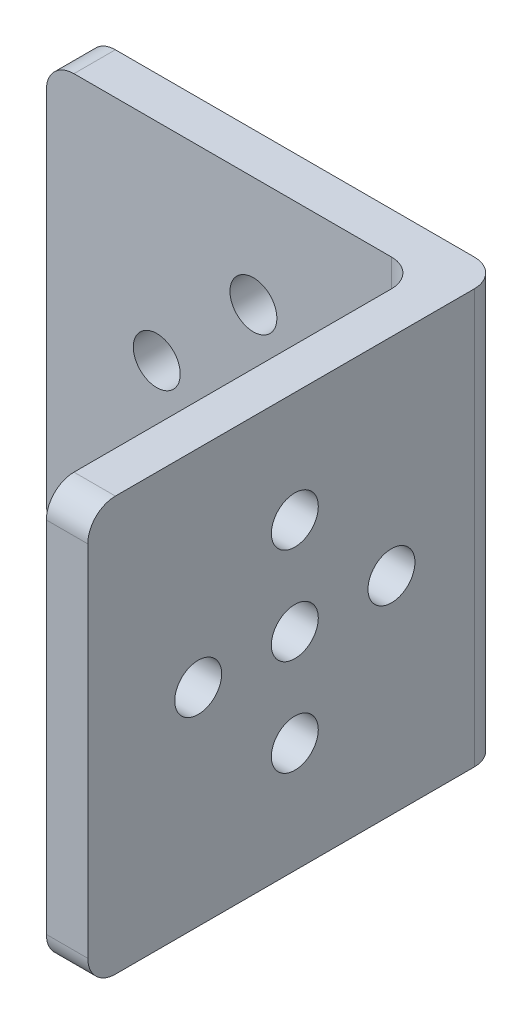
ISO-10303-21;
HEADER;
FILE_DESCRIPTION(('STEP AP214'),'2;1');
FILE_NAME('part.step','',(''),(''),'','','');
FILE_SCHEMA(('AUTOMOTIVE_DESIGN { 1 0 10303 214 1 1 1 1 }'));
ENDSEC;
DATA;
#1=APPLICATION_CONTEXT('core data for automotive mechanical design processes');
#2=APPLICATION_PROTOCOL_DEFINITION('international standard','automotive_design',2000,#1);
#3=PRODUCT_CONTEXT('',#1,'mechanical');
#4=PRODUCT('Part','Part','',(#3));
#5=PRODUCT_RELATED_PRODUCT_CATEGORY('part','',(#4));
#6=PRODUCT_DEFINITION_FORMATION('','',#4);
#7=PRODUCT_DEFINITION_CONTEXT('part definition',#1,'design');
#8=PRODUCT_DEFINITION('design','',#6,#7);
#9=PRODUCT_DEFINITION_SHAPE('','',#8);
#10=(LENGTH_UNIT() NAMED_UNIT(*) SI_UNIT(.MILLI.,.METRE.));
#11=(NAMED_UNIT(*) PLANE_ANGLE_UNIT() SI_UNIT($,.RADIAN.));
#12=(NAMED_UNIT(*) SI_UNIT($,.STERADIAN.) SOLID_ANGLE_UNIT());
#13=UNCERTAINTY_MEASURE_WITH_UNIT(LENGTH_MEASURE(1.E-05),#10,'distance_accuracy_value','');
#14=(GEOMETRIC_REPRESENTATION_CONTEXT(3) GLOBAL_UNCERTAINTY_ASSIGNED_CONTEXT((#13)) GLOBAL_UNIT_ASSIGNED_CONTEXT((#10,
#11,#12)) REPRESENTATION_CONTEXT('',''));
#15=CARTESIAN_POINT('',(0.,0.,0.));
#16=DIRECTION('',(0.,0.,1.));
#17=DIRECTION('',(1.,0.,0.));
#18=AXIS2_PLACEMENT_3D('',#15,#16,#17);
#19=CARTESIAN_POINT('',(15.,0.,30.));
#20=DIRECTION('',(-1.,0.,0.));
#21=DIRECTION('',(0.,-1.,0.));
#22=AXIS2_PLACEMENT_3D('',#19,#20,#21);
#23=PLANE('',#22);
#24=CARTESIAN_POINT('',(15.,7.,15.));
#25=DIRECTION('',(1.,0.,0.));
#26=DIRECTION('',(0.,0.,-1.));
#27=AXIS2_PLACEMENT_3D('',#24,#25,#26);
#28=CIRCLE('',#27,1.69999999999999);
#29=CARTESIAN_POINT('',(15.,7.,13.3));
#30=VERTEX_POINT('',#29);
#31=EDGE_CURVE('E493',#30,#30,#28,.T.);
#32=ORIENTED_EDGE('',*,*,#31,.F.);
#33=EDGE_LOOP('',(#32));
#34=FACE_BOUND('',#33,.T.);
#35=CARTESIAN_POINT('',(15.,-7.,15.));
#36=DIRECTION('',(1.,0.,0.));
#37=DIRECTION('',(0.,0.,-1.));
#38=AXIS2_PLACEMENT_3D('',#35,#36,#37);
#39=CIRCLE('',#38,1.69999999999999);
#40=CARTESIAN_POINT('',(15.,-7.,13.3));
#41=VERTEX_POINT('',#40);
#42=EDGE_CURVE('E515',#41,#41,#39,.T.);
#43=ORIENTED_EDGE('',*,*,#42,.F.);
#44=EDGE_LOOP('',(#43));
#45=FACE_BOUND('',#44,.T.);
#46=DIRECTION('',(0.,0.,-1.));
#47=VECTOR('',#46,1.);
#48=CARTESIAN_POINT('',(15.,15.,30.));
#49=LINE('',#48,#47);
#50=CARTESIAN_POINT('',(15.,15.,28.));
#51=VERTEX_POINT('',#50);
#52=CARTESIAN_POINT('',(15.,15.,2.));
#53=VERTEX_POINT('',#52);
#54=EDGE_CURVE('E127',#51,#53,#49,.T.);
#55=ORIENTED_EDGE('',*,*,#54,.F.);
#56=CARTESIAN_POINT('',(15.,13.,28.));
#57=DIRECTION('',(-1.,0.,0.));
#58=DIRECTION('',(0.,-1.,0.));
#59=AXIS2_PLACEMENT_3D('',#56,#57,#58);
#60=CIRCLE('',#59,2.);
#61=CARTESIAN_POINT('',(15.,13.,30.));
#62=VERTEX_POINT('',#61);
#63=EDGE_CURVE('E198',#51,#62,#60,.F.);
#64=ORIENTED_EDGE('',*,*,#63,.T.);
#65=DIRECTION('',(0.,1.,0.));
#66=VECTOR('',#65,1.);
#67=CARTESIAN_POINT('',(15.,0.,30.));
#68=LINE('',#67,#66);
#69=CARTESIAN_POINT('',(15.,-13.,30.));
#70=VERTEX_POINT('',#69);
#71=EDGE_CURVE('E206',#70,#62,#68,.T.);
#72=ORIENTED_EDGE('',*,*,#71,.F.);
#73=CARTESIAN_POINT('',(15.,-13.,28.));
#74=DIRECTION('',(-1.,0.,0.));
#75=DIRECTION('',(0.,-1.,0.));
#76=AXIS2_PLACEMENT_3D('',#73,#74,#75);
#77=CIRCLE('',#76,2.);
#78=CARTESIAN_POINT('',(15.,-15.,28.));
#79=VERTEX_POINT('',#78);
#80=EDGE_CURVE('E196',#70,#79,#77,.F.);
#81=ORIENTED_EDGE('',*,*,#80,.T.);
#82=DIRECTION('',(0.,0.,-1.));
#83=VECTOR('',#82,1.);
#84=CARTESIAN_POINT('',(15.,-15.,30.));
#85=LINE('',#84,#83);
#86=CARTESIAN_POINT('',(15.,-15.,2.));
#87=VERTEX_POINT('',#86);
#88=EDGE_CURVE('E138',#79,#87,#85,.T.);
#89=ORIENTED_EDGE('',*,*,#88,.T.);
#90=DIRECTION('',(0.,1.,0.));
#91=VECTOR('',#90,1.);
#92=CARTESIAN_POINT('',(15.,0.,2.));
#93=LINE('',#92,#91);
#94=EDGE_CURVE('E145',#87,#53,#93,.T.);
#95=ORIENTED_EDGE('',*,*,#94,.T.);
#96=EDGE_LOOP('',(#55,#64,#72,#81,#89,#95));
#97=FACE_BOUND('',#96,.T.);
#98=CARTESIAN_POINT('',(15.,0.,8.));
#99=DIRECTION('',(1.,0.,0.));
#100=DIRECTION('',(0.,0.,-1.));
#101=AXIS2_PLACEMENT_3D('',#98,#99,#100);
#102=CIRCLE('',#101,1.69999999999999);
#103=CARTESIAN_POINT('',(15.,0.,6.30000000000001));
#104=VERTEX_POINT('',#103);
#105=EDGE_CURVE('E509',#104,#104,#102,.T.);
#106=ORIENTED_EDGE('',*,*,#105,.F.);
#107=EDGE_LOOP('',(#106));
#108=FACE_BOUND('',#107,.T.);
#109=CARTESIAN_POINT('',(15.,0.,15.));
#110=DIRECTION('',(1.,0.,0.));
#111=DIRECTION('',(0.,0.,-1.));
#112=AXIS2_PLACEMENT_3D('',#109,#110,#111);
#113=CIRCLE('',#112,1.69999999999999);
#114=CARTESIAN_POINT('',(15.,0.,13.3));
#115=VERTEX_POINT('',#114);
#116=EDGE_CURVE('E503',#115,#115,#113,.T.);
#117=ORIENTED_EDGE('',*,*,#116,.F.);
#118=EDGE_LOOP('',(#117));
#119=FACE_BOUND('',#118,.T.);
#120=CARTESIAN_POINT('',(15.,0.,22.));
#121=DIRECTION('',(1.,0.,0.));
#122=DIRECTION('',(0.,0.,-1.));
#123=AXIS2_PLACEMENT_3D('',#120,#121,#122);
#124=CIRCLE('',#123,1.69999999999999);
#125=CARTESIAN_POINT('',(15.,0.,20.3));
#126=VERTEX_POINT('',#125);
#127=EDGE_CURVE('E495',#126,#126,#124,.T.);
#128=ORIENTED_EDGE('',*,*,#127,.F.);
#129=EDGE_LOOP('',(#128));
#130=FACE_BOUND('',#129,.T.);
#131=ADVANCED_FACE('F37',(#34,#45,#97,#108,#119,#130),#23,.F.);
#132=CARTESIAN_POINT('',(0.,15.,3.));
#133=DIRECTION('',(0.,1.,0.));
#134=DIRECTION('',(-1.,0.,0.));
#135=AXIS2_PLACEMENT_3D('',#132,#133,#134);
#136=PLANE('',#135);
#137=DIRECTION('',(1.,0.,0.));
#138=VECTOR('',#137,1.);
#139=CARTESIAN_POINT('',(0.,15.,0.));
#140=LINE('',#139,#138);
#141=CARTESIAN_POINT('',(-13.,15.,0.));
#142=VERTEX_POINT('',#141);
#143=CARTESIAN_POINT('',(13.,15.,0.));
#144=VERTEX_POINT('',#143);
#145=EDGE_CURVE('E221',#142,#144,#140,.T.);
#146=ORIENTED_EDGE('',*,*,#145,.F.);
#147=DIRECTION('',(0.,0.,-1.));
#148=VECTOR('',#147,1.);
#149=CARTESIAN_POINT('',(-13.,15.,3.));
#150=LINE('',#149,#148);
#151=CARTESIAN_POINT('',(-13.,15.,3.));
#152=VERTEX_POINT('',#151);
#153=EDGE_CURVE('E194',#142,#152,#150,.F.);
#154=ORIENTED_EDGE('',*,*,#153,.T.);
#155=DIRECTION('',(1.,0.,0.));
#156=VECTOR('',#155,1.);
#157=CARTESIAN_POINT('',(0.,15.,3.));
#158=LINE('',#157,#156);
#159=CARTESIAN_POINT('',(10.,15.,3.));
#160=VERTEX_POINT('',#159);
#161=EDGE_CURVE('E222',#152,#160,#158,.T.);
#162=ORIENTED_EDGE('',*,*,#161,.T.);
#163=CARTESIAN_POINT('',(10.,15.,5.));
#164=DIRECTION('',(0.,1.,0.));
#165=DIRECTION('',(-1.,0.,0.));
#166=AXIS2_PLACEMENT_3D('',#163,#164,#165);
#167=CIRCLE('',#166,2.);
#168=CARTESIAN_POINT('',(12.,15.,5.));
#169=VERTEX_POINT('',#168);
#170=EDGE_CURVE('E172',#160,#169,#167,.F.);
#171=ORIENTED_EDGE('',*,*,#170,.T.);
#172=DIRECTION('',(0.,0.,-1.));
#173=VECTOR('',#172,1.);
#174=CARTESIAN_POINT('',(12.,15.,30.));
#175=LINE('',#174,#173);
#176=CARTESIAN_POINT('',(12.,15.,28.));
#177=VERTEX_POINT('',#176);
#178=EDGE_CURVE('E139',#177,#169,#175,.T.);
#179=ORIENTED_EDGE('',*,*,#178,.F.);
#180=DIRECTION('',(1.,0.,0.));
#181=VECTOR('',#180,1.);
#182=CARTESIAN_POINT('',(0.,15.,28.));
#183=LINE('',#182,#181);
#184=EDGE_CURVE('E135',#177,#51,#183,.T.);
#185=ORIENTED_EDGE('',*,*,#184,.T.);
#186=ORIENTED_EDGE('',*,*,#54,.T.);
#187=CARTESIAN_POINT('',(13.,15.,2.));
#188=DIRECTION('',(0.,1.,0.));
#189=DIRECTION('',(-1.,0.,0.));
#190=AXIS2_PLACEMENT_3D('',#187,#188,#189);
#191=CIRCLE('',#190,2.);
#192=EDGE_CURVE('E131',#53,#144,#191,.T.);
#193=ORIENTED_EDGE('',*,*,#192,.T.);
#194=EDGE_LOOP('',(#146,#154,#162,#171,#179,#185,#186,#193));
#195=FACE_BOUND('',#194,.T.);
#196=ADVANCED_FACE('F130',(#195),#136,.T.);
#197=CARTESIAN_POINT('',(-15.,0.,3.));
#198=DIRECTION('',(-1.,0.,0.));
#199=DIRECTION('',(0.,0.,1.));
#200=AXIS2_PLACEMENT_3D('',#197,#198,#199);
#201=PLANE('',#200);
#202=DIRECTION('',(0.,1.,0.));
#203=VECTOR('',#202,1.);
#204=CARTESIAN_POINT('',(-15.,0.,0.));
#205=LINE('',#204,#203);
#206=CARTESIAN_POINT('',(-15.,-13.,0.));
#207=VERTEX_POINT('',#206);
#208=CARTESIAN_POINT('',(-15.,13.,0.));
#209=VERTEX_POINT('',#208);
#210=EDGE_CURVE('E226',#207,#209,#205,.T.);
#211=ORIENTED_EDGE('',*,*,#210,.F.);
#212=DIRECTION('',(0.,0.,-1.));
#213=VECTOR('',#212,1.);
#214=CARTESIAN_POINT('',(-15.,-13.,3.));
#215=LINE('',#214,#213);
#216=CARTESIAN_POINT('',(-15.,-13.,3.));
#217=VERTEX_POINT('',#216);
#218=EDGE_CURVE('E187',#207,#217,#215,.F.);
#219=ORIENTED_EDGE('',*,*,#218,.T.);
#220=DIRECTION('',(0.,1.,0.));
#221=VECTOR('',#220,1.);
#222=CARTESIAN_POINT('',(-15.,0.,3.));
#223=LINE('',#222,#221);
#224=CARTESIAN_POINT('',(-15.,13.,3.));
#225=VERTEX_POINT('',#224);
#226=EDGE_CURVE('E154',#217,#225,#223,.T.);
#227=ORIENTED_EDGE('',*,*,#226,.T.);
#228=DIRECTION('',(0.,0.,-1.));
#229=VECTOR('',#228,1.);
#230=CARTESIAN_POINT('',(-15.,13.,3.));
#231=LINE('',#230,#229);
#232=EDGE_CURVE('E184',#225,#209,#231,.T.);
#233=ORIENTED_EDGE('',*,*,#232,.T.);
#234=EDGE_LOOP('',(#211,#219,#227,#233));
#235=FACE_BOUND('',#234,.T.);
#236=ADVANCED_FACE('F247',(#235),#201,.T.);
#237=CARTESIAN_POINT('',(0.,-15.,3.));
#238=DIRECTION('',(0.,1.,0.));
#239=DIRECTION('',(-1.,0.,0.));
#240=AXIS2_PLACEMENT_3D('',#237,#238,#239);
#241=PLANE('',#240);
#242=DIRECTION('',(1.,0.,0.));
#243=VECTOR('',#242,1.);
#244=CARTESIAN_POINT('',(0.,-15.,3.));
#245=LINE('',#244,#243);
#246=CARTESIAN_POINT('',(-13.,-15.,3.));
#247=VERTEX_POINT('',#246);
#248=CARTESIAN_POINT('',(10.,-15.,3.));
#249=VERTEX_POINT('',#248);
#250=EDGE_CURVE('E152',#247,#249,#245,.T.);
#251=ORIENTED_EDGE('',*,*,#250,.F.);
#252=DIRECTION('',(0.,0.,-1.));
#253=VECTOR('',#252,1.);
#254=CARTESIAN_POINT('',(-13.,-15.,0.));
#255=LINE('',#254,#253);
#256=CARTESIAN_POINT('',(-13.,-15.,0.));
#257=VERTEX_POINT('',#256);
#258=EDGE_CURVE('E177',#247,#257,#255,.T.);
#259=ORIENTED_EDGE('',*,*,#258,.T.);
#260=DIRECTION('',(1.,0.,0.));
#261=VECTOR('',#260,1.);
#262=CARTESIAN_POINT('',(0.,-15.,0.));
#263=LINE('',#262,#261);
#264=CARTESIAN_POINT('',(13.,-15.,0.));
#265=VERTEX_POINT('',#264);
#266=EDGE_CURVE('E157',#257,#265,#263,.T.);
#267=ORIENTED_EDGE('',*,*,#266,.T.);
#268=CARTESIAN_POINT('',(13.,-15.,2.));
#269=DIRECTION('',(0.,1.,0.));
#270=DIRECTION('',(-1.,0.,0.));
#271=AXIS2_PLACEMENT_3D('',#268,#269,#270);
#272=CIRCLE('',#271,2.);
#273=EDGE_CURVE('E161',#265,#87,#272,.F.);
#274=ORIENTED_EDGE('',*,*,#273,.T.);
#275=ORIENTED_EDGE('',*,*,#88,.F.);
#276=DIRECTION('',(1.,0.,0.));
#277=VECTOR('',#276,1.);
#278=CARTESIAN_POINT('',(12.,-15.,28.));
#279=LINE('',#278,#277);
#280=CARTESIAN_POINT('',(12.,-15.,28.));
#281=VERTEX_POINT('',#280);
#282=EDGE_CURVE('E175',#79,#281,#279,.F.);
#283=ORIENTED_EDGE('',*,*,#282,.T.);
#284=DIRECTION('',(0.,0.,-1.));
#285=VECTOR('',#284,1.);
#286=CARTESIAN_POINT('',(12.,-15.,30.));
#287=LINE('',#286,#285);
#288=CARTESIAN_POINT('',(12.,-15.,5.));
#289=VERTEX_POINT('',#288);
#290=EDGE_CURVE('E211',#281,#289,#287,.T.);
#291=ORIENTED_EDGE('',*,*,#290,.T.);
#292=CARTESIAN_POINT('',(10.,-15.,5.));
#293=DIRECTION('',(0.,1.,0.));
#294=DIRECTION('',(-1.,0.,0.));
#295=AXIS2_PLACEMENT_3D('',#292,#293,#294);
#296=CIRCLE('',#295,2.);
#297=EDGE_CURVE('E169',#289,#249,#296,.T.);
#298=ORIENTED_EDGE('',*,*,#297,.T.);
#299=EDGE_LOOP('',(#251,#259,#267,#274,#275,#283,#291,#298));
#300=FACE_BOUND('',#299,.T.);
#301=ADVANCED_FACE('F233',(#300),#241,.F.);
#302=CARTESIAN_POINT('',(0.,0.,3.));
#303=DIRECTION('',(0.,0.,1.));
#304=DIRECTION('',(1.,0.,0.));
#305=AXIS2_PLACEMENT_3D('',#302,#303,#304);
#306=PLANE('',#305);
#307=CARTESIAN_POINT('',(0.,7.,3.));
#308=DIRECTION('',(0.,0.,1.));
#309=DIRECTION('',(1.,0.,0.));
#310=AXIS2_PLACEMENT_3D('',#307,#308,#309);
#311=CIRCLE('',#310,1.69999999999999);
#312=CARTESIAN_POINT('',(1.69999999999999,7.,3.));
#313=VERTEX_POINT('',#312);
#314=EDGE_CURVE('E521',#313,#313,#311,.T.);
#315=ORIENTED_EDGE('',*,*,#314,.F.);
#316=EDGE_LOOP('',(#315));
#317=FACE_BOUND('',#316,.T.);
#318=CARTESIAN_POINT('',(-7.,0.,3.));
#319=DIRECTION('',(0.,0.,1.));
#320=DIRECTION('',(1.,0.,0.));
#321=AXIS2_PLACEMENT_3D('',#318,#319,#320);
#322=CIRCLE('',#321,1.69999999999999);
#323=CARTESIAN_POINT('',(-5.30000000000001,0.,3.));
#324=VERTEX_POINT('',#323);
#325=EDGE_CURVE('E527',#324,#324,#322,.T.);
#326=ORIENTED_EDGE('',*,*,#325,.F.);
#327=EDGE_LOOP('',(#326));
#328=FACE_BOUND('',#327,.T.);
#329=CARTESIAN_POINT('',(7.,0.,3.));
#330=DIRECTION('',(0.,0.,1.));
#331=DIRECTION('',(1.,0.,0.));
#332=AXIS2_PLACEMENT_3D('',#329,#330,#331);
#333=CIRCLE('',#332,1.69999999999999);
#334=CARTESIAN_POINT('',(8.69999999999999,0.,3.));
#335=VERTEX_POINT('',#334);
#336=EDGE_CURVE('E533',#335,#335,#333,.T.);
#337=ORIENTED_EDGE('',*,*,#336,.F.);
#338=EDGE_LOOP('',(#337));
#339=FACE_BOUND('',#338,.T.);
#340=CARTESIAN_POINT('',(0.,-7.,3.));
#341=DIRECTION('',(0.,0.,1.));
#342=DIRECTION('',(1.,0.,0.));
#343=AXIS2_PLACEMENT_3D('',#340,#341,#342);
#344=CIRCLE('',#343,1.69999999999999);
#345=CARTESIAN_POINT('',(1.69999999999999,-7.,3.));
#346=VERTEX_POINT('',#345);
#347=EDGE_CURVE('E539',#346,#346,#344,.T.);
#348=ORIENTED_EDGE('',*,*,#347,.F.);
#349=EDGE_LOOP('',(#348));
#350=FACE_BOUND('',#349,.T.);
#351=CARTESIAN_POINT('',(0.,0.,3.));
#352=DIRECTION('',(0.,0.,1.));
#353=DIRECTION('',(1.,0.,0.));
#354=AXIS2_PLACEMENT_3D('',#351,#352,#353);
#355=CIRCLE('',#354,1.69999999999999);
#356=CARTESIAN_POINT('',(1.69999999999999,0.,3.));
#357=VERTEX_POINT('',#356);
#358=EDGE_CURVE('E214',#357,#357,#355,.T.);
#359=ORIENTED_EDGE('',*,*,#358,.F.);
#360=EDGE_LOOP('',(#359));
#361=FACE_BOUND('',#360,.T.);
#362=ORIENTED_EDGE('',*,*,#226,.F.);
#363=CARTESIAN_POINT('',(-13.,-13.,3.));
#364=DIRECTION('',(0.,0.,1.));
#365=DIRECTION('',(1.,0.,0.));
#366=AXIS2_PLACEMENT_3D('',#363,#364,#365);
#367=CIRCLE('',#366,2.);
#368=EDGE_CURVE('E191',#217,#247,#367,.T.);
#369=ORIENTED_EDGE('',*,*,#368,.T.);
#370=ORIENTED_EDGE('',*,*,#250,.T.);
#371=DIRECTION('',(0.,-1.,0.));
#372=VECTOR('',#371,1.);
#373=CARTESIAN_POINT('',(10.,0.,3.));
#374=LINE('',#373,#372);
#375=EDGE_CURVE('E166',#249,#160,#374,.F.);
#376=ORIENTED_EDGE('',*,*,#375,.T.);
#377=ORIENTED_EDGE('',*,*,#161,.F.);
#378=CARTESIAN_POINT('',(-13.,13.,3.));
#379=DIRECTION('',(0.,0.,1.));
#380=DIRECTION('',(1.,0.,0.));
#381=AXIS2_PLACEMENT_3D('',#378,#379,#380);
#382=CIRCLE('',#381,2.);
#383=EDGE_CURVE('E189',#152,#225,#382,.T.);
#384=ORIENTED_EDGE('',*,*,#383,.T.);
#385=EDGE_LOOP('',(#362,#369,#370,#376,#377,#384));
#386=FACE_BOUND('',#385,.T.);
#387=ADVANCED_FACE('F244',(#317,#328,#339,#350,#361,#386),#306,.T.);
#388=CARTESIAN_POINT('',(0.,0.,0.));
#389=DIRECTION('',(0.,0.,1.));
#390=DIRECTION('',(1.,0.,0.));
#391=AXIS2_PLACEMENT_3D('',#388,#389,#390);
#392=PLANE('',#391);
#393=CARTESIAN_POINT('',(0.,7.,0.));
#394=DIRECTION('',(0.,0.,1.));
#395=DIRECTION('',(1.,0.,0.));
#396=AXIS2_PLACEMENT_3D('',#393,#394,#395);
#397=CIRCLE('',#396,1.69999999999999);
#398=CARTESIAN_POINT('',(1.69999999999999,7.,0.));
#399=VERTEX_POINT('',#398);
#400=EDGE_CURVE('E524',#399,#399,#397,.T.);
#401=ORIENTED_EDGE('',*,*,#400,.T.);
#402=EDGE_LOOP('',(#401));
#403=FACE_BOUND('',#402,.T.);
#404=CARTESIAN_POINT('',(-7.,0.,0.));
#405=DIRECTION('',(0.,0.,1.));
#406=DIRECTION('',(1.,0.,0.));
#407=AXIS2_PLACEMENT_3D('',#404,#405,#406);
#408=CIRCLE('',#407,1.69999999999999);
#409=CARTESIAN_POINT('',(-5.30000000000001,0.,0.));
#410=VERTEX_POINT('',#409);
#411=EDGE_CURVE('E530',#410,#410,#408,.T.);
#412=ORIENTED_EDGE('',*,*,#411,.T.);
#413=EDGE_LOOP('',(#412));
#414=FACE_BOUND('',#413,.T.);
#415=CARTESIAN_POINT('',(7.,0.,0.));
#416=DIRECTION('',(0.,0.,1.));
#417=DIRECTION('',(1.,0.,0.));
#418=AXIS2_PLACEMENT_3D('',#415,#416,#417);
#419=CIRCLE('',#418,1.69999999999999);
#420=CARTESIAN_POINT('',(8.69999999999999,0.,0.));
#421=VERTEX_POINT('',#420);
#422=EDGE_CURVE('E536',#421,#421,#419,.T.);
#423=ORIENTED_EDGE('',*,*,#422,.T.);
#424=EDGE_LOOP('',(#423));
#425=FACE_BOUND('',#424,.T.);
#426=CARTESIAN_POINT('',(0.,-7.,0.));
#427=DIRECTION('',(0.,0.,1.));
#428=DIRECTION('',(1.,0.,0.));
#429=AXIS2_PLACEMENT_3D('',#426,#427,#428);
#430=CIRCLE('',#429,1.69999999999999);
#431=CARTESIAN_POINT('',(1.69999999999999,-7.,0.));
#432=VERTEX_POINT('',#431);
#433=EDGE_CURVE('E542',#432,#432,#430,.T.);
#434=ORIENTED_EDGE('',*,*,#433,.T.);
#435=EDGE_LOOP('',(#434));
#436=FACE_BOUND('',#435,.T.);
#437=CARTESIAN_POINT('',(0.,0.,0.));
#438=DIRECTION('',(0.,0.,1.));
#439=DIRECTION('',(1.,0.,0.));
#440=AXIS2_PLACEMENT_3D('',#437,#438,#439);
#441=CIRCLE('',#440,1.69999999999999);
#442=CARTESIAN_POINT('',(1.69999999999999,0.,0.));
#443=VERTEX_POINT('',#442);
#444=EDGE_CURVE('E209',#443,#443,#441,.T.);
#445=ORIENTED_EDGE('',*,*,#444,.T.);
#446=EDGE_LOOP('',(#445));
#447=FACE_BOUND('',#446,.T.);
#448=ORIENTED_EDGE('',*,*,#266,.F.);
#449=CARTESIAN_POINT('',(-13.,-13.,0.));
#450=DIRECTION('',(0.,0.,1.));
#451=DIRECTION('',(1.,0.,0.));
#452=AXIS2_PLACEMENT_3D('',#449,#450,#451);
#453=CIRCLE('',#452,2.);
#454=EDGE_CURVE('E182',#257,#207,#453,.F.);
#455=ORIENTED_EDGE('',*,*,#454,.T.);
#456=ORIENTED_EDGE('',*,*,#210,.T.);
#457=CARTESIAN_POINT('',(-13.,13.,0.));
#458=DIRECTION('',(0.,0.,1.));
#459=DIRECTION('',(1.,0.,0.));
#460=AXIS2_PLACEMENT_3D('',#457,#458,#459);
#461=CIRCLE('',#460,2.);
#462=EDGE_CURVE('E180',#209,#142,#461,.F.);
#463=ORIENTED_EDGE('',*,*,#462,.T.);
#464=ORIENTED_EDGE('',*,*,#145,.T.);
#465=DIRECTION('',(0.,1.,0.));
#466=VECTOR('',#465,1.);
#467=CARTESIAN_POINT('',(13.,0.,0.));
#468=LINE('',#467,#466);
#469=EDGE_CURVE('E147',#144,#265,#468,.F.);
#470=ORIENTED_EDGE('',*,*,#469,.T.);
#471=EDGE_LOOP('',(#448,#455,#456,#463,#464,#470));
#472=FACE_BOUND('',#471,.T.);
#473=ADVANCED_FACE('F235',(#403,#414,#425,#436,#447,#472),#392,.F.);
#474=CARTESIAN_POINT('',(12.,0.,30.));
#475=DIRECTION('',(1.,0.,0.));
#476=DIRECTION('',(0.,1.,0.));
#477=AXIS2_PLACEMENT_3D('',#474,#475,#476);
#478=PLANE('',#477);
#479=CARTESIAN_POINT('',(12.,7.,15.));
#480=DIRECTION('',(1.,0.,0.));
#481=DIRECTION('',(0.,1.,0.));
#482=AXIS2_PLACEMENT_3D('',#479,#480,#481);
#483=CIRCLE('',#482,1.69999999999999);
#484=CARTESIAN_POINT('',(12.,8.69999999999999,15.));
#485=VERTEX_POINT('',#484);
#486=EDGE_CURVE('E491',#485,#485,#483,.T.);
#487=ORIENTED_EDGE('',*,*,#486,.T.);
#488=EDGE_LOOP('',(#487));
#489=FACE_BOUND('',#488,.T.);
#490=CARTESIAN_POINT('',(12.,0.,22.));
#491=DIRECTION('',(1.,0.,0.));
#492=DIRECTION('',(0.,1.,0.));
#493=AXIS2_PLACEMENT_3D('',#490,#491,#492);
#494=CIRCLE('',#493,1.69999999999999);
#495=CARTESIAN_POINT('',(12.,1.69999999999999,22.));
#496=VERTEX_POINT('',#495);
#497=EDGE_CURVE('E500',#496,#496,#494,.T.);
#498=ORIENTED_EDGE('',*,*,#497,.T.);
#499=EDGE_LOOP('',(#498));
#500=FACE_BOUND('',#499,.T.);
#501=CARTESIAN_POINT('',(12.,0.,15.));
#502=DIRECTION('',(1.,0.,0.));
#503=DIRECTION('',(0.,1.,0.));
#504=AXIS2_PLACEMENT_3D('',#501,#502,#503);
#505=CIRCLE('',#504,1.69999999999999);
#506=CARTESIAN_POINT('',(12.,1.69999999999999,15.));
#507=VERTEX_POINT('',#506);
#508=EDGE_CURVE('E506',#507,#507,#505,.T.);
#509=ORIENTED_EDGE('',*,*,#508,.T.);
#510=EDGE_LOOP('',(#509));
#511=FACE_BOUND('',#510,.T.);
#512=CARTESIAN_POINT('',(12.,0.,8.));
#513=DIRECTION('',(1.,0.,0.));
#514=DIRECTION('',(0.,1.,0.));
#515=AXIS2_PLACEMENT_3D('',#512,#513,#514);
#516=CIRCLE('',#515,1.69999999999999);
#517=CARTESIAN_POINT('',(12.,1.69999999999999,8.));
#518=VERTEX_POINT('',#517);
#519=EDGE_CURVE('E512',#518,#518,#516,.T.);
#520=ORIENTED_EDGE('',*,*,#519,.T.);
#521=EDGE_LOOP('',(#520));
#522=FACE_BOUND('',#521,.T.);
#523=CARTESIAN_POINT('',(12.,-7.,15.));
#524=DIRECTION('',(1.,0.,0.));
#525=DIRECTION('',(0.,1.,0.));
#526=AXIS2_PLACEMENT_3D('',#523,#524,#525);
#527=CIRCLE('',#526,1.69999999999999);
#528=CARTESIAN_POINT('',(12.,-5.30000000000001,15.));
#529=VERTEX_POINT('',#528);
#530=EDGE_CURVE('E518',#529,#529,#527,.T.);
#531=ORIENTED_EDGE('',*,*,#530,.T.);
#532=EDGE_LOOP('',(#531));
#533=FACE_BOUND('',#532,.T.);
#534=DIRECTION('',(0.,-1.,0.));
#535=VECTOR('',#534,1.);
#536=CARTESIAN_POINT('',(12.,0.,30.));
#537=LINE('',#536,#535);
#538=CARTESIAN_POINT('',(12.,13.,30.));
#539=VERTEX_POINT('',#538);
#540=CARTESIAN_POINT('',(12.,-13.,30.));
#541=VERTEX_POINT('',#540);
#542=EDGE_CURVE('E207',#539,#541,#537,.T.);
#543=ORIENTED_EDGE('',*,*,#542,.F.);
#544=CARTESIAN_POINT('',(12.,13.,28.));
#545=DIRECTION('',(1.,0.,0.));
#546=DIRECTION('',(0.,1.,0.));
#547=AXIS2_PLACEMENT_3D('',#544,#545,#546);
#548=CIRCLE('',#547,2.);
#549=EDGE_CURVE('E11',#539,#177,#548,.F.);
#550=ORIENTED_EDGE('',*,*,#549,.T.);
#551=ORIENTED_EDGE('',*,*,#178,.T.);
#552=DIRECTION('',(0.,-1.,0.));
#553=VECTOR('',#552,1.);
#554=CARTESIAN_POINT('',(12.,0.,5.));
#555=LINE('',#554,#553);
#556=EDGE_CURVE('E163',#169,#289,#555,.T.);
#557=ORIENTED_EDGE('',*,*,#556,.T.);
#558=ORIENTED_EDGE('',*,*,#290,.F.);
#559=CARTESIAN_POINT('',(12.,-13.,28.));
#560=DIRECTION('',(1.,0.,0.));
#561=DIRECTION('',(0.,1.,0.));
#562=AXIS2_PLACEMENT_3D('',#559,#560,#561);
#563=CIRCLE('',#562,2.);
#564=EDGE_CURVE('E45',#281,#541,#563,.F.);
#565=ORIENTED_EDGE('',*,*,#564,.T.);
#566=EDGE_LOOP('',(#543,#550,#551,#557,#558,#565));
#567=FACE_BOUND('',#566,.T.);
#568=ADVANCED_FACE('F260',(#489,#500,#511,#522,#533,#567),#478,.F.);
#569=CARTESIAN_POINT('',(0.,0.,30.));
#570=DIRECTION('',(0.,0.,1.));
#571=DIRECTION('',(1.,0.,0.));
#572=AXIS2_PLACEMENT_3D('',#569,#570,#571);
#573=PLANE('',#572);
#574=ORIENTED_EDGE('',*,*,#71,.T.);
#575=DIRECTION('',(1.,0.,0.));
#576=VECTOR('',#575,1.);
#577=CARTESIAN_POINT('',(0.,13.,30.));
#578=LINE('',#577,#576);
#579=EDGE_CURVE('E58',#62,#539,#578,.F.);
#580=ORIENTED_EDGE('',*,*,#579,.T.);
#581=ORIENTED_EDGE('',*,*,#542,.T.);
#582=DIRECTION('',(1.,0.,0.));
#583=VECTOR('',#582,1.);
#584=CARTESIAN_POINT('',(15.,-13.,30.));
#585=LINE('',#584,#583);
#586=EDGE_CURVE('E200',#541,#70,#585,.T.);
#587=ORIENTED_EDGE('',*,*,#586,.T.);
#588=EDGE_LOOP('',(#574,#580,#581,#587));
#589=FACE_BOUND('',#588,.T.);
#590=ADVANCED_FACE('F205',(#589),#573,.T.);
#591=CARTESIAN_POINT('',(0.,0.,3.));
#592=DIRECTION('',(0.,0.,1.));
#593=DIRECTION('',(1.,0.,0.));
#594=AXIS2_PLACEMENT_3D('',#591,#592,#593);
#595=CYLINDRICAL_SURFACE('',#594,1.69999999999999);
#596=ORIENTED_EDGE('',*,*,#444,.F.);
#597=EDGE_LOOP('',(#596));
#598=FACE_BOUND('',#597,.T.);
#599=ORIENTED_EDGE('',*,*,#358,.T.);
#600=EDGE_LOOP('',(#599));
#601=FACE_BOUND('',#600,.T.);
#602=ADVANCED_FACE('F268',(#598,#601),#595,.F.);
#603=CARTESIAN_POINT('',(0.,-7.,3.));
#604=DIRECTION('',(0.,0.,1.));
#605=DIRECTION('',(1.,0.,0.));
#606=AXIS2_PLACEMENT_3D('',#603,#604,#605);
#607=CYLINDRICAL_SURFACE('',#606,1.69999999999999);
#608=ORIENTED_EDGE('',*,*,#433,.F.);
#609=EDGE_LOOP('',(#608));
#610=FACE_BOUND('',#609,.T.);
#611=ORIENTED_EDGE('',*,*,#347,.T.);
#612=EDGE_LOOP('',(#611));
#613=FACE_BOUND('',#612,.T.);
#614=ADVANCED_FACE('F342',(#610,#613),#607,.F.);
#615=CARTESIAN_POINT('',(7.,0.,3.));
#616=DIRECTION('',(0.,0.,1.));
#617=DIRECTION('',(1.,0.,0.));
#618=AXIS2_PLACEMENT_3D('',#615,#616,#617);
#619=CYLINDRICAL_SURFACE('',#618,1.69999999999999);
#620=ORIENTED_EDGE('',*,*,#422,.F.);
#621=EDGE_LOOP('',(#620));
#622=FACE_BOUND('',#621,.T.);
#623=ORIENTED_EDGE('',*,*,#336,.T.);
#624=EDGE_LOOP('',(#623));
#625=FACE_BOUND('',#624,.T.);
#626=ADVANCED_FACE('F349',(#622,#625),#619,.F.);
#627=CARTESIAN_POINT('',(-7.,0.,3.));
#628=DIRECTION('',(0.,0.,1.));
#629=DIRECTION('',(1.,0.,0.));
#630=AXIS2_PLACEMENT_3D('',#627,#628,#629);
#631=CYLINDRICAL_SURFACE('',#630,1.69999999999999);
#632=ORIENTED_EDGE('',*,*,#411,.F.);
#633=EDGE_LOOP('',(#632));
#634=FACE_BOUND('',#633,.T.);
#635=ORIENTED_EDGE('',*,*,#325,.T.);
#636=EDGE_LOOP('',(#635));
#637=FACE_BOUND('',#636,.T.);
#638=ADVANCED_FACE('F357',(#634,#637),#631,.F.);
#639=CARTESIAN_POINT('',(0.,7.,3.));
#640=DIRECTION('',(0.,0.,1.));
#641=DIRECTION('',(1.,0.,0.));
#642=AXIS2_PLACEMENT_3D('',#639,#640,#641);
#643=CYLINDRICAL_SURFACE('',#642,1.69999999999999);
#644=ORIENTED_EDGE('',*,*,#400,.F.);
#645=EDGE_LOOP('',(#644));
#646=FACE_BOUND('',#645,.T.);
#647=ORIENTED_EDGE('',*,*,#314,.T.);
#648=EDGE_LOOP('',(#647));
#649=FACE_BOUND('',#648,.T.);
#650=ADVANCED_FACE('F365',(#646,#649),#643,.F.);
#651=CARTESIAN_POINT('',(15.,-7.,15.));
#652=DIRECTION('',(1.,0.,0.));
#653=DIRECTION('',(0.,0.,-1.));
#654=AXIS2_PLACEMENT_3D('',#651,#652,#653);
#655=CYLINDRICAL_SURFACE('',#654,1.69999999999999);
#656=ORIENTED_EDGE('',*,*,#530,.F.);
#657=EDGE_LOOP('',(#656));
#658=FACE_BOUND('',#657,.T.);
#659=ORIENTED_EDGE('',*,*,#42,.T.);
#660=EDGE_LOOP('',(#659));
#661=FACE_BOUND('',#660,.T.);
#662=ADVANCED_FACE('F373',(#658,#661),#655,.F.);
#663=CARTESIAN_POINT('',(15.,0.,8.));
#664=DIRECTION('',(1.,0.,0.));
#665=DIRECTION('',(0.,0.,-1.));
#666=AXIS2_PLACEMENT_3D('',#663,#664,#665);
#667=CYLINDRICAL_SURFACE('',#666,1.69999999999999);
#668=ORIENTED_EDGE('',*,*,#519,.F.);
#669=EDGE_LOOP('',(#668));
#670=FACE_BOUND('',#669,.T.);
#671=ORIENTED_EDGE('',*,*,#105,.T.);
#672=EDGE_LOOP('',(#671));
#673=FACE_BOUND('',#672,.T.);
#674=ADVANCED_FACE('F381',(#670,#673),#667,.F.);
#675=CARTESIAN_POINT('',(15.,0.,15.));
#676=DIRECTION('',(1.,0.,0.));
#677=DIRECTION('',(0.,0.,-1.));
#678=AXIS2_PLACEMENT_3D('',#675,#676,#677);
#679=CYLINDRICAL_SURFACE('',#678,1.69999999999999);
#680=ORIENTED_EDGE('',*,*,#508,.F.);
#681=EDGE_LOOP('',(#680));
#682=FACE_BOUND('',#681,.T.);
#683=ORIENTED_EDGE('',*,*,#116,.T.);
#684=EDGE_LOOP('',(#683));
#685=FACE_BOUND('',#684,.T.);
#686=ADVANCED_FACE('F389',(#682,#685),#679,.F.);
#687=CARTESIAN_POINT('',(15.,0.,22.));
#688=DIRECTION('',(1.,0.,0.));
#689=DIRECTION('',(0.,0.,-1.));
#690=AXIS2_PLACEMENT_3D('',#687,#688,#689);
#691=CYLINDRICAL_SURFACE('',#690,1.69999999999999);
#692=ORIENTED_EDGE('',*,*,#497,.F.);
#693=EDGE_LOOP('',(#692));
#694=FACE_BOUND('',#693,.T.);
#695=ORIENTED_EDGE('',*,*,#127,.T.);
#696=EDGE_LOOP('',(#695));
#697=FACE_BOUND('',#696,.T.);
#698=ADVANCED_FACE('F397',(#694,#697),#691,.F.);
#699=CARTESIAN_POINT('',(15.,7.,15.));
#700=DIRECTION('',(1.,0.,0.));
#701=DIRECTION('',(0.,0.,-1.));
#702=AXIS2_PLACEMENT_3D('',#699,#700,#701);
#703=CYLINDRICAL_SURFACE('',#702,1.69999999999999);
#704=ORIENTED_EDGE('',*,*,#486,.F.);
#705=EDGE_LOOP('',(#704));
#706=FACE_BOUND('',#705,.T.);
#707=ORIENTED_EDGE('',*,*,#31,.T.);
#708=EDGE_LOOP('',(#707));
#709=FACE_BOUND('',#708,.T.);
#710=ADVANCED_FACE('F294',(#706,#709),#703,.F.);
#711=CARTESIAN_POINT('',(13.,0.,2.));
#712=DIRECTION('',(0.,1.,0.));
#713=DIRECTION('',(-1.,0.,0.));
#714=AXIS2_PLACEMENT_3D('',#711,#712,#713);
#715=CYLINDRICAL_SURFACE('',#714,2.);
#716=ORIENTED_EDGE('',*,*,#273,.F.);
#717=ORIENTED_EDGE('',*,*,#469,.F.);
#718=ORIENTED_EDGE('',*,*,#192,.F.);
#719=ORIENTED_EDGE('',*,*,#94,.F.);
#720=EDGE_LOOP('',(#716,#717,#718,#719));
#721=FACE_BOUND('',#720,.T.);
#722=ADVANCED_FACE('F144',(#721),#715,.T.);
#723=CARTESIAN_POINT('',(10.,0.,5.));
#724=DIRECTION('',(0.,-1.,0.));
#725=DIRECTION('',(1.,0.,0.));
#726=AXIS2_PLACEMENT_3D('',#723,#724,#725);
#727=CYLINDRICAL_SURFACE('',#726,2.);
#728=ORIENTED_EDGE('',*,*,#170,.F.);
#729=ORIENTED_EDGE('',*,*,#375,.F.);
#730=ORIENTED_EDGE('',*,*,#297,.F.);
#731=ORIENTED_EDGE('',*,*,#556,.F.);
#732=EDGE_LOOP('',(#728,#729,#730,#731));
#733=FACE_BOUND('',#732,.T.);
#734=ADVANCED_FACE('F256',(#733),#727,.F.);
#735=CARTESIAN_POINT('',(-13.,-13.,3.));
#736=DIRECTION('',(0.,0.,1.));
#737=DIRECTION('',(1.,0.,0.));
#738=AXIS2_PLACEMENT_3D('',#735,#736,#737);
#739=CYLINDRICAL_SURFACE('',#738,2.);
#740=ORIENTED_EDGE('',*,*,#368,.F.);
#741=ORIENTED_EDGE('',*,*,#218,.F.);
#742=ORIENTED_EDGE('',*,*,#454,.F.);
#743=ORIENTED_EDGE('',*,*,#258,.F.);
#744=EDGE_LOOP('',(#740,#741,#742,#743));
#745=FACE_BOUND('',#744,.T.);
#746=ADVANCED_FACE('F250',(#745),#739,.T.);
#747=CARTESIAN_POINT('',(-13.,13.,3.));
#748=DIRECTION('',(0.,0.,-1.));
#749=DIRECTION('',(-1.,0.,0.));
#750=AXIS2_PLACEMENT_3D('',#747,#748,#749);
#751=CYLINDRICAL_SURFACE('',#750,2.);
#752=ORIENTED_EDGE('',*,*,#383,.F.);
#753=ORIENTED_EDGE('',*,*,#153,.F.);
#754=ORIENTED_EDGE('',*,*,#462,.F.);
#755=ORIENTED_EDGE('',*,*,#232,.F.);
#756=EDGE_LOOP('',(#752,#753,#754,#755));
#757=FACE_BOUND('',#756,.T.);
#758=ADVANCED_FACE('F240',(#757),#751,.T.);
#759=CARTESIAN_POINT('',(0.,13.,28.));
#760=DIRECTION('',(1.,0.,0.));
#761=DIRECTION('',(0.,1.,0.));
#762=AXIS2_PLACEMENT_3D('',#759,#760,#761);
#763=CYLINDRICAL_SURFACE('',#762,2.);
#764=ORIENTED_EDGE('',*,*,#549,.F.);
#765=ORIENTED_EDGE('',*,*,#579,.F.);
#766=ORIENTED_EDGE('',*,*,#63,.F.);
#767=ORIENTED_EDGE('',*,*,#184,.F.);
#768=EDGE_LOOP('',(#764,#765,#766,#767));
#769=FACE_BOUND('',#768,.T.);
#770=ADVANCED_FACE('F259',(#769),#763,.T.);
#771=CARTESIAN_POINT('',(0.,-13.,28.));
#772=DIRECTION('',(-1.,0.,0.));
#773=DIRECTION('',(0.,-1.,0.));
#774=AXIS2_PLACEMENT_3D('',#771,#772,#773);
#775=CYLINDRICAL_SURFACE('',#774,2.);
#776=ORIENTED_EDGE('',*,*,#564,.F.);
#777=ORIENTED_EDGE('',*,*,#282,.F.);
#778=ORIENTED_EDGE('',*,*,#80,.F.);
#779=ORIENTED_EDGE('',*,*,#586,.F.);
#780=EDGE_LOOP('',(#776,#777,#778,#779));
#781=FACE_BOUND('',#780,.T.);
#782=ADVANCED_FACE('F39',(#781),#775,.T.);
#783=CLOSED_SHELL('',(#131,#196,#236,#301,#387,#473,#568,#590,#602,#614,#626,#638,#650,#662,
#674,#686,#698,#710,#722,#734,#746,#758,#770,#782));
#784=MANIFOLD_SOLID_BREP('B2',#783);
#785=ADVANCED_BREP_SHAPE_REPRESENTATION('',(#18,#784),#14);
#786=SHAPE_DEFINITION_REPRESENTATION(#9,#785);
ENDSEC;
END-ISO-10303-21;
